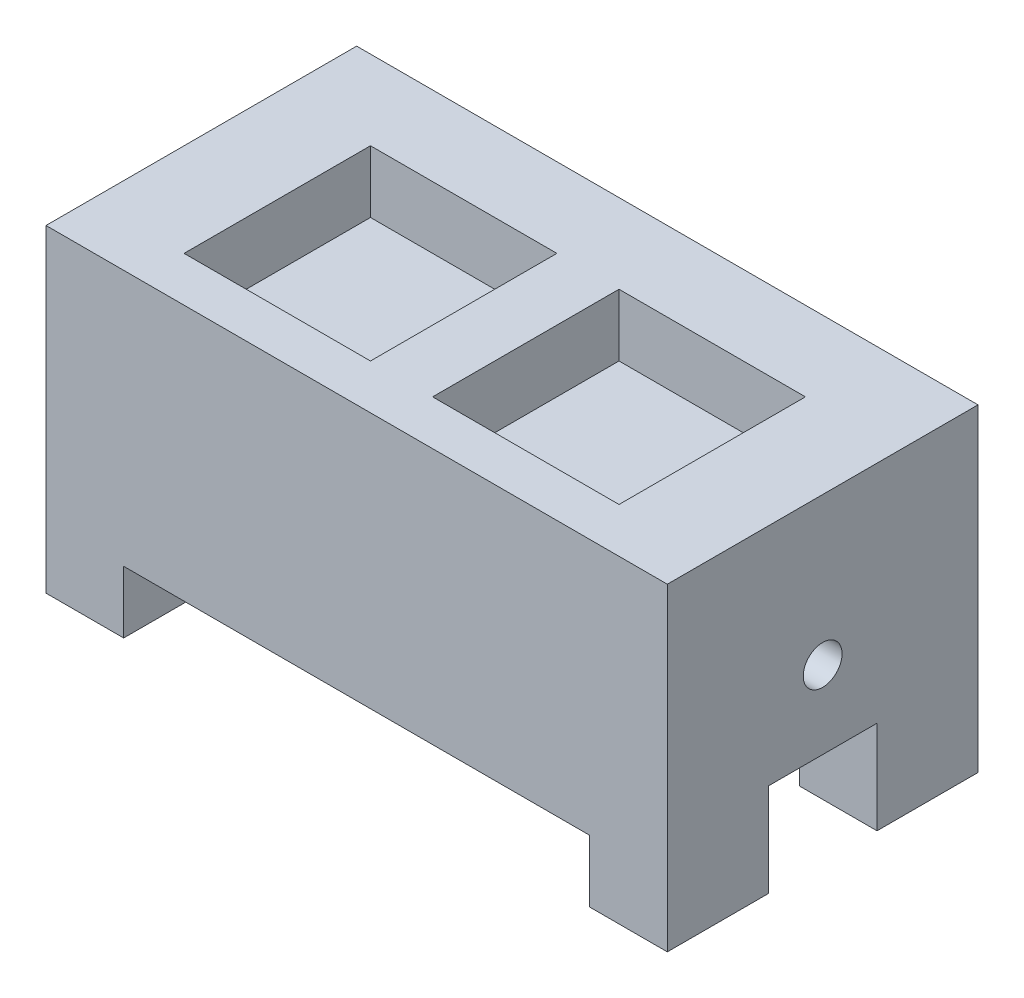
ISO-10303-21;
HEADER;
FILE_DESCRIPTION(('STEP AP214'),'2;1');
FILE_NAME('part.step','',(''),(''),'','','');
FILE_SCHEMA(('AUTOMOTIVE_DESIGN { 1 0 10303 214 1 1 1 1 }'));
ENDSEC;
DATA;
#1=APPLICATION_CONTEXT('core data for automotive mechanical design processes');
#2=APPLICATION_PROTOCOL_DEFINITION('international standard','automotive_design',2000,#1);
#3=PRODUCT_CONTEXT('',#1,'mechanical');
#4=PRODUCT('Part','Part','',(#3));
#5=PRODUCT_RELATED_PRODUCT_CATEGORY('part','',(#4));
#6=PRODUCT_DEFINITION_FORMATION('','',#4);
#7=PRODUCT_DEFINITION_CONTEXT('part definition',#1,'design');
#8=PRODUCT_DEFINITION('design','',#6,#7);
#9=PRODUCT_DEFINITION_SHAPE('','',#8);
#10=(LENGTH_UNIT() NAMED_UNIT(*) SI_UNIT(.MILLI.,.METRE.));
#11=(NAMED_UNIT(*) PLANE_ANGLE_UNIT() SI_UNIT($,.RADIAN.));
#12=(NAMED_UNIT(*) SI_UNIT($,.STERADIAN.) SOLID_ANGLE_UNIT());
#13=UNCERTAINTY_MEASURE_WITH_UNIT(LENGTH_MEASURE(1.E-05),#10,'distance_accuracy_value','');
#14=(GEOMETRIC_REPRESENTATION_CONTEXT(3) GLOBAL_UNCERTAINTY_ASSIGNED_CONTEXT((#13)) GLOBAL_UNIT_ASSIGNED_CONTEXT((#10,
#11,#12)) REPRESENTATION_CONTEXT('',''));
#15=CARTESIAN_POINT('',(0.,0.,0.));
#16=DIRECTION('',(0.,0.,1.));
#17=DIRECTION('',(1.,0.,0.));
#18=AXIS2_PLACEMENT_3D('',#15,#16,#17);
#19=CARTESIAN_POINT('',(0.,0.,40.));
#20=DIRECTION('',(0.,1.,0.));
#21=DIRECTION('',(0.,0.,1.));
#22=AXIS2_PLACEMENT_3D('',#19,#20,#21);
#23=PLANE('',#22);
#24=DIRECTION('',(-1.,0.,0.));
#25=VECTOR('',#24,1.);
#26=CARTESIAN_POINT('',(80.,0.,13.));
#27=LINE('',#26,#25);
#28=CARTESIAN_POINT('',(10.,0.,13.));
#29=VERTEX_POINT('',#28);
#30=CARTESIAN_POINT('',(0.,0.,13.));
#31=VERTEX_POINT('',#30);
#32=EDGE_CURVE('E310',#29,#31,#27,.T.);
#33=ORIENTED_EDGE('',*,*,#32,.T.);
#34=DIRECTION('',(0.,0.,-1.));
#35=VECTOR('',#34,1.);
#36=CARTESIAN_POINT('',(0.,0.,40.));
#37=LINE('',#36,#35);
#38=CARTESIAN_POINT('',(0.,0.,0.));
#39=VERTEX_POINT('',#38);
#40=EDGE_CURVE('E443',#31,#39,#37,.T.);
#41=ORIENTED_EDGE('',*,*,#40,.T.);
#42=DIRECTION('',(1.,0.,0.));
#43=VECTOR('',#42,1.);
#44=CARTESIAN_POINT('',(0.,0.,0.));
#45=LINE('',#44,#43);
#46=CARTESIAN_POINT('',(10.,0.,0.));
#47=VERTEX_POINT('',#46);
#48=EDGE_CURVE('E394',#39,#47,#45,.T.);
#49=ORIENTED_EDGE('',*,*,#48,.T.);
#50=DIRECTION('',(0.,0.,-1.));
#51=VECTOR('',#50,1.);
#52=CARTESIAN_POINT('',(10.,0.,40.));
#53=LINE('',#52,#51);
#54=EDGE_CURVE('E439',#29,#47,#53,.T.);
#55=ORIENTED_EDGE('',*,*,#54,.F.);
#56=EDGE_LOOP('',(#33,#41,#49,#55));
#57=FACE_BOUND('',#56,.T.);
#58=ADVANCED_FACE('F39',(#57),#23,.F.);
#59=CARTESIAN_POINT('',(10.,0.,40.));
#60=DIRECTION('',(-1.,0.,0.));
#61=DIRECTION('',(0.,0.,1.));
#62=AXIS2_PLACEMENT_3D('',#59,#60,#61);
#63=PLANE('',#62);
#64=DIRECTION('',(0.,1.,0.));
#65=VECTOR('',#64,1.);
#66=CARTESIAN_POINT('',(10.,0.,13.));
#67=LINE('',#66,#65);
#68=CARTESIAN_POINT('',(10.,8.,13.));
#69=VERTEX_POINT('',#68);
#70=EDGE_CURVE('E344',#29,#69,#67,.T.);
#71=ORIENTED_EDGE('',*,*,#70,.F.);
#72=ORIENTED_EDGE('',*,*,#54,.T.);
#73=DIRECTION('',(0.,1.,0.));
#74=VECTOR('',#73,1.);
#75=CARTESIAN_POINT('',(10.,0.,0.));
#76=LINE('',#75,#74);
#77=CARTESIAN_POINT('',(10.,8.,0.));
#78=VERTEX_POINT('',#77);
#79=EDGE_CURVE('E398',#47,#78,#76,.T.);
#80=ORIENTED_EDGE('',*,*,#79,.T.);
#81=DIRECTION('',(0.,0.,-1.));
#82=VECTOR('',#81,1.);
#83=CARTESIAN_POINT('',(10.,8.,40.));
#84=LINE('',#83,#82);
#85=EDGE_CURVE('E434',#69,#78,#84,.T.);
#86=ORIENTED_EDGE('',*,*,#85,.F.);
#87=EDGE_LOOP('',(#71,#72,#80,#86));
#88=FACE_BOUND('',#87,.T.);
#89=ADVANCED_FACE('F468',(#88),#63,.F.);
#90=CARTESIAN_POINT('',(10.,8.,40.));
#91=DIRECTION('',(0.,1.,0.));
#92=DIRECTION('',(0.,0.,1.));
#93=AXIS2_PLACEMENT_3D('',#90,#91,#92);
#94=PLANE('',#93);
#95=DIRECTION('',(1.,0.,0.));
#96=VECTOR('',#95,1.);
#97=CARTESIAN_POINT('',(10.,8.,13.));
#98=LINE('',#97,#96);
#99=CARTESIAN_POINT('',(70.,8.,13.));
#100=VERTEX_POINT('',#99);
#101=EDGE_CURVE('E341',#69,#100,#98,.T.);
#102=ORIENTED_EDGE('',*,*,#101,.F.);
#103=ORIENTED_EDGE('',*,*,#85,.T.);
#104=DIRECTION('',(1.,0.,0.));
#105=VECTOR('',#104,1.);
#106=CARTESIAN_POINT('',(10.,8.,0.));
#107=LINE('',#106,#105);
#108=CARTESIAN_POINT('',(70.,8.,0.));
#109=VERTEX_POINT('',#108);
#110=EDGE_CURVE('E402',#78,#109,#107,.T.);
#111=ORIENTED_EDGE('',*,*,#110,.T.);
#112=DIRECTION('',(0.,0.,-1.));
#113=VECTOR('',#112,1.);
#114=CARTESIAN_POINT('',(70.,8.,40.));
#115=LINE('',#114,#113);
#116=EDGE_CURVE('E429',#100,#109,#115,.T.);
#117=ORIENTED_EDGE('',*,*,#116,.F.);
#118=EDGE_LOOP('',(#102,#103,#111,#117));
#119=FACE_BOUND('',#118,.T.);
#120=ADVANCED_FACE('F525',(#119),#94,.F.);
#121=CARTESIAN_POINT('',(70.,8.,40.));
#122=DIRECTION('',(1.,0.,0.));
#123=DIRECTION('',(0.,0.,-1.));
#124=AXIS2_PLACEMENT_3D('',#121,#122,#123);
#125=PLANE('',#124);
#126=DIRECTION('',(0.,-1.,0.));
#127=VECTOR('',#126,1.);
#128=CARTESIAN_POINT('',(70.,8.,13.));
#129=LINE('',#128,#127);
#130=CARTESIAN_POINT('',(70.,0.,13.));
#131=VERTEX_POINT('',#130);
#132=EDGE_CURVE('E298',#100,#131,#129,.T.);
#133=ORIENTED_EDGE('',*,*,#132,.F.);
#134=ORIENTED_EDGE('',*,*,#116,.T.);
#135=DIRECTION('',(0.,-1.,0.));
#136=VECTOR('',#135,1.);
#137=CARTESIAN_POINT('',(70.,8.,0.));
#138=LINE('',#137,#136);
#139=CARTESIAN_POINT('',(70.,0.,0.));
#140=VERTEX_POINT('',#139);
#141=EDGE_CURVE('E406',#109,#140,#138,.T.);
#142=ORIENTED_EDGE('',*,*,#141,.T.);
#143=DIRECTION('',(0.,0.,-1.));
#144=VECTOR('',#143,1.);
#145=CARTESIAN_POINT('',(70.,0.,40.));
#146=LINE('',#145,#144);
#147=EDGE_CURVE('E424',#131,#140,#146,.T.);
#148=ORIENTED_EDGE('',*,*,#147,.F.);
#149=EDGE_LOOP('',(#133,#134,#142,#148));
#150=FACE_BOUND('',#149,.T.);
#151=ADVANCED_FACE('F521',(#150),#125,.F.);
#152=CARTESIAN_POINT('',(70.,0.,40.));
#153=DIRECTION('',(0.,1.,0.));
#154=DIRECTION('',(0.,0.,1.));
#155=AXIS2_PLACEMENT_3D('',#152,#153,#154);
#156=PLANE('',#155);
#157=CARTESIAN_POINT('',(80.,0.,13.));
#158=VERTEX_POINT('',#157);
#159=EDGE_CURVE('E311',#158,#131,#27,.T.);
#160=ORIENTED_EDGE('',*,*,#159,.T.);
#161=ORIENTED_EDGE('',*,*,#147,.T.);
#162=DIRECTION('',(1.,0.,0.));
#163=VECTOR('',#162,1.);
#164=CARTESIAN_POINT('',(70.,0.,0.));
#165=LINE('',#164,#163);
#166=CARTESIAN_POINT('',(80.,0.,0.));
#167=VERTEX_POINT('',#166);
#168=EDGE_CURVE('E410',#140,#167,#165,.T.);
#169=ORIENTED_EDGE('',*,*,#168,.T.);
#170=DIRECTION('',(0.,0.,-1.));
#171=VECTOR('',#170,1.);
#172=CARTESIAN_POINT('',(80.,0.,40.));
#173=LINE('',#172,#171);
#174=EDGE_CURVE('E419',#158,#167,#173,.T.);
#175=ORIENTED_EDGE('',*,*,#174,.F.);
#176=EDGE_LOOP('',(#160,#161,#169,#175));
#177=FACE_BOUND('',#176,.T.);
#178=ADVANCED_FACE('F517',(#177),#156,.F.);
#179=CARTESIAN_POINT('',(80.,41.,40.));
#180=DIRECTION('',(0.,-1.,0.));
#181=DIRECTION('',(1.,0.,0.));
#182=AXIS2_PLACEMENT_3D('',#179,#180,#181);
#183=PLANE('',#182);
#184=DIRECTION('',(1.,0.,0.));
#185=VECTOR('',#184,1.);
#186=CARTESIAN_POINT('',(12.,41.,34.2209125407346));
#187=LINE('',#186,#185);
#188=CARTESIAN_POINT('',(12.,41.,34.2209125407346));
#189=VERTEX_POINT('',#188);
#190=CARTESIAN_POINT('',(36.,41.,34.2209125407346));
#191=VERTEX_POINT('',#190);
#192=EDGE_CURVE('E237',#189,#191,#187,.T.);
#193=ORIENTED_EDGE('',*,*,#192,.F.);
#194=DIRECTION('',(0.,0.,1.));
#195=VECTOR('',#194,1.);
#196=CARTESIAN_POINT('',(12.,41.,10.2209125407346));
#197=LINE('',#196,#195);
#198=CARTESIAN_POINT('',(12.,41.,10.2209125407346));
#199=VERTEX_POINT('',#198);
#200=EDGE_CURVE('E55',#199,#189,#197,.T.);
#201=ORIENTED_EDGE('',*,*,#200,.F.);
#202=DIRECTION('',(-1.,0.,0.));
#203=VECTOR('',#202,1.);
#204=CARTESIAN_POINT('',(12.,41.,10.2209125407346));
#205=LINE('',#204,#203);
#206=CARTESIAN_POINT('',(36.,41.,10.2209125407346));
#207=VERTEX_POINT('',#206);
#208=EDGE_CURVE('E224',#207,#199,#205,.T.);
#209=ORIENTED_EDGE('',*,*,#208,.F.);
#210=DIRECTION('',(0.,0.,-1.));
#211=VECTOR('',#210,1.);
#212=CARTESIAN_POINT('',(36.,41.,10.2209125407346));
#213=LINE('',#212,#211);
#214=EDGE_CURVE('E228',#191,#207,#213,.T.);
#215=ORIENTED_EDGE('',*,*,#214,.F.);
#216=EDGE_LOOP('',(#193,#201,#209,#215));
#217=FACE_BOUND('',#216,.T.);
#218=DIRECTION('',(1.,0.,0.));
#219=VECTOR('',#218,1.);
#220=CARTESIAN_POINT('',(44.,41.,34.2209125407346));
#221=LINE('',#220,#219);
#222=CARTESIAN_POINT('',(44.,41.,34.2209125407346));
#223=VERTEX_POINT('',#222);
#224=CARTESIAN_POINT('',(68.,41.,34.2209125407346));
#225=VERTEX_POINT('',#224);
#226=EDGE_CURVE('E273',#223,#225,#221,.T.);
#227=ORIENTED_EDGE('',*,*,#226,.F.);
#228=DIRECTION('',(0.,0.,1.));
#229=VECTOR('',#228,1.);
#230=CARTESIAN_POINT('',(44.,41.,10.2209125407346));
#231=LINE('',#230,#229);
#232=CARTESIAN_POINT('',(44.,41.,10.2209125407346));
#233=VERTEX_POINT('',#232);
#234=EDGE_CURVE('E63',#233,#223,#231,.T.);
#235=ORIENTED_EDGE('',*,*,#234,.F.);
#236=DIRECTION('',(-1.,0.,0.));
#237=VECTOR('',#236,1.);
#238=CARTESIAN_POINT('',(44.,41.,10.2209125407346));
#239=LINE('',#238,#237);
#240=CARTESIAN_POINT('',(68.,41.,10.2209125407346));
#241=VERTEX_POINT('',#240);
#242=EDGE_CURVE('E258',#241,#233,#239,.T.);
#243=ORIENTED_EDGE('',*,*,#242,.F.);
#244=DIRECTION('',(0.,0.,-1.));
#245=VECTOR('',#244,1.);
#246=CARTESIAN_POINT('',(68.,41.,10.2209125407346));
#247=LINE('',#246,#245);
#248=EDGE_CURVE('E277',#225,#241,#247,.T.);
#249=ORIENTED_EDGE('',*,*,#248,.F.);
#250=EDGE_LOOP('',(#227,#235,#243,#249));
#251=FACE_BOUND('',#250,.T.);
#252=DIRECTION('',(-1.,0.,0.));
#253=VECTOR('',#252,1.);
#254=CARTESIAN_POINT('',(80.,41.,0.));
#255=LINE('',#254,#253);
#256=CARTESIAN_POINT('',(80.,41.,0.));
#257=VERTEX_POINT('',#256);
#258=CARTESIAN_POINT('',(0.,41.,0.));
#259=VERTEX_POINT('',#258);
#260=EDGE_CURVE('E359',#257,#259,#255,.T.);
#261=ORIENTED_EDGE('',*,*,#260,.T.);
#262=DIRECTION('',(0.,0.,-1.));
#263=VECTOR('',#262,1.);
#264=CARTESIAN_POINT('',(0.,41.,40.));
#265=LINE('',#264,#263);
#266=CARTESIAN_POINT('',(0.,41.,40.));
#267=VERTEX_POINT('',#266);
#268=EDGE_CURVE('E11',#267,#259,#265,.T.);
#269=ORIENTED_EDGE('',*,*,#268,.F.);
#270=DIRECTION('',(-1.,0.,0.));
#271=VECTOR('',#270,1.);
#272=CARTESIAN_POINT('',(80.,41.,40.));
#273=LINE('',#272,#271);
#274=CARTESIAN_POINT('',(80.,41.,40.));
#275=VERTEX_POINT('',#274);
#276=EDGE_CURVE('E360',#275,#267,#273,.T.);
#277=ORIENTED_EDGE('',*,*,#276,.F.);
#278=DIRECTION('',(0.,0.,-1.));
#279=VECTOR('',#278,1.);
#280=CARTESIAN_POINT('',(80.,41.,40.));
#281=LINE('',#280,#279);
#282=EDGE_CURVE('E386',#275,#257,#281,.T.);
#283=ORIENTED_EDGE('',*,*,#282,.T.);
#284=EDGE_LOOP('',(#261,#269,#277,#283));
#285=FACE_BOUND('',#284,.T.);
#286=ADVANCED_FACE('F41',(#217,#251,#285),#183,.F.);
#287=CARTESIAN_POINT('',(0.,41.,40.));
#288=DIRECTION('',(1.,0.,0.));
#289=DIRECTION('',(0.,0.,-1.));
#290=AXIS2_PLACEMENT_3D('',#287,#288,#289);
#291=PLANE('',#290);
#292=CARTESIAN_POINT('',(0.,22.,20.));
#293=DIRECTION('',(-1.,0.,0.));
#294=DIRECTION('',(0.,0.,1.));
#295=AXIS2_PLACEMENT_3D('',#292,#293,#294);
#296=CIRCLE('',#295,2.5);
#297=CARTESIAN_POINT('',(0.,22.,22.5));
#298=VERTEX_POINT('',#297);
#299=EDGE_CURVE('E299',#298,#298,#296,.T.);
#300=ORIENTED_EDGE('',*,*,#299,.F.);
#301=EDGE_LOOP('',(#300));
#302=FACE_BOUND('',#301,.T.);
#303=DIRECTION('',(0.,0.,1.));
#304=VECTOR('',#303,1.);
#305=CARTESIAN_POINT('',(0.,12.,13.));
#306=LINE('',#305,#304);
#307=CARTESIAN_POINT('',(0.,12.,13.));
#308=VERTEX_POINT('',#307);
#309=CARTESIAN_POINT('',(0.,12.,27.));
#310=VERTEX_POINT('',#309);
#311=EDGE_CURVE('E303',#308,#310,#306,.T.);
#312=ORIENTED_EDGE('',*,*,#311,.T.);
#313=DIRECTION('',(0.,1.,0.));
#314=VECTOR('',#313,1.);
#315=CARTESIAN_POINT('',(0.,0.,27.));
#316=LINE('',#315,#314);
#317=CARTESIAN_POINT('',(0.,0.,27.));
#318=VERTEX_POINT('',#317);
#319=EDGE_CURVE('E323',#318,#310,#316,.T.);
#320=ORIENTED_EDGE('',*,*,#319,.F.);
#321=CARTESIAN_POINT('',(0.,0.,40.));
#322=VERTEX_POINT('',#321);
#323=EDGE_CURVE('E48',#322,#318,#37,.T.);
#324=ORIENTED_EDGE('',*,*,#323,.F.);
#325=DIRECTION('',(0.,-1.,0.));
#326=VECTOR('',#325,1.);
#327=CARTESIAN_POINT('',(0.,41.,40.));
#328=LINE('',#327,#326);
#329=EDGE_CURVE('E364',#267,#322,#328,.T.);
#330=ORIENTED_EDGE('',*,*,#329,.F.);
#331=ORIENTED_EDGE('',*,*,#268,.T.);
#332=DIRECTION('',(0.,-1.,0.));
#333=VECTOR('',#332,1.);
#334=CARTESIAN_POINT('',(0.,41.,0.));
#335=LINE('',#334,#333);
#336=EDGE_CURVE('E390',#259,#39,#335,.T.);
#337=ORIENTED_EDGE('',*,*,#336,.T.);
#338=ORIENTED_EDGE('',*,*,#40,.F.);
#339=DIRECTION('',(0.,1.,0.));
#340=VECTOR('',#339,1.);
#341=CARTESIAN_POINT('',(0.,0.,13.));
#342=LINE('',#341,#340);
#343=EDGE_CURVE('E319',#31,#308,#342,.T.);
#344=ORIENTED_EDGE('',*,*,#343,.T.);
#345=EDGE_LOOP('',(#312,#320,#324,#330,#331,#337,#338,#344));
#346=FACE_BOUND('',#345,.T.);
#347=ADVANCED_FACE('F458',(#302,#346),#291,.F.);
#348=ORIENTED_EDGE('',*,*,#323,.T.);
#349=DIRECTION('',(-1.,0.,0.));
#350=VECTOR('',#349,1.);
#351=CARTESIAN_POINT('',(80.,0.,27.));
#352=LINE('',#351,#350);
#353=CARTESIAN_POINT('',(10.,0.,27.));
#354=VERTEX_POINT('',#353);
#355=EDGE_CURVE('E306',#354,#318,#352,.T.);
#356=ORIENTED_EDGE('',*,*,#355,.F.);
#357=CARTESIAN_POINT('',(10.,0.,40.));
#358=VERTEX_POINT('',#357);
#359=EDGE_CURVE('E440',#358,#354,#53,.T.);
#360=ORIENTED_EDGE('',*,*,#359,.F.);
#361=DIRECTION('',(1.,0.,0.));
#362=VECTOR('',#361,1.);
#363=CARTESIAN_POINT('',(0.,0.,40.));
#364=LINE('',#363,#362);
#365=EDGE_CURVE('E368',#322,#358,#364,.T.);
#366=ORIENTED_EDGE('',*,*,#365,.F.);
#367=EDGE_LOOP('',(#348,#356,#360,#366));
#368=FACE_BOUND('',#367,.T.);
#369=ADVANCED_FACE('F508',(#368),#23,.F.);
#370=ORIENTED_EDGE('',*,*,#359,.T.);
#371=DIRECTION('',(0.,1.,0.));
#372=VECTOR('',#371,1.);
#373=CARTESIAN_POINT('',(10.,0.,27.));
#374=LINE('',#373,#372);
#375=CARTESIAN_POINT('',(10.,8.,27.));
#376=VERTEX_POINT('',#375);
#377=EDGE_CURVE('E355',#354,#376,#374,.T.);
#378=ORIENTED_EDGE('',*,*,#377,.T.);
#379=CARTESIAN_POINT('',(10.,8.,40.));
#380=VERTEX_POINT('',#379);
#381=EDGE_CURVE('E435',#380,#376,#84,.T.);
#382=ORIENTED_EDGE('',*,*,#381,.F.);
#383=DIRECTION('',(0.,1.,0.));
#384=VECTOR('',#383,1.);
#385=CARTESIAN_POINT('',(10.,0.,40.));
#386=LINE('',#385,#384);
#387=EDGE_CURVE('E371',#358,#380,#386,.T.);
#388=ORIENTED_EDGE('',*,*,#387,.F.);
#389=EDGE_LOOP('',(#370,#378,#382,#388));
#390=FACE_BOUND('',#389,.T.);
#391=ADVANCED_FACE('F506',(#390),#63,.F.);
#392=ORIENTED_EDGE('',*,*,#381,.T.);
#393=DIRECTION('',(1.,0.,0.));
#394=VECTOR('',#393,1.);
#395=CARTESIAN_POINT('',(10.,8.,27.));
#396=LINE('',#395,#394);
#397=CARTESIAN_POINT('',(70.,8.,27.));
#398=VERTEX_POINT('',#397);
#399=EDGE_CURVE('E351',#376,#398,#396,.T.);
#400=ORIENTED_EDGE('',*,*,#399,.T.);
#401=CARTESIAN_POINT('',(70.,8.,40.));
#402=VERTEX_POINT('',#401);
#403=EDGE_CURVE('E430',#402,#398,#115,.T.);
#404=ORIENTED_EDGE('',*,*,#403,.F.);
#405=DIRECTION('',(1.,0.,0.));
#406=VECTOR('',#405,1.);
#407=CARTESIAN_POINT('',(10.,8.,40.));
#408=LINE('',#407,#406);
#409=EDGE_CURVE('E374',#380,#402,#408,.T.);
#410=ORIENTED_EDGE('',*,*,#409,.F.);
#411=EDGE_LOOP('',(#392,#400,#404,#410));
#412=FACE_BOUND('',#411,.T.);
#413=ADVANCED_FACE('F503',(#412),#94,.F.);
#414=ORIENTED_EDGE('',*,*,#403,.T.);
#415=DIRECTION('',(0.,-1.,0.));
#416=VECTOR('',#415,1.);
#417=CARTESIAN_POINT('',(70.,7.99999999999999,27.));
#418=LINE('',#417,#416);
#419=CARTESIAN_POINT('',(70.,0.,27.));
#420=VERTEX_POINT('',#419);
#421=EDGE_CURVE('E347',#398,#420,#418,.T.);
#422=ORIENTED_EDGE('',*,*,#421,.T.);
#423=CARTESIAN_POINT('',(70.,0.,40.));
#424=VERTEX_POINT('',#423);
#425=EDGE_CURVE('E425',#424,#420,#146,.T.);
#426=ORIENTED_EDGE('',*,*,#425,.F.);
#427=DIRECTION('',(0.,-1.,0.));
#428=VECTOR('',#427,1.);
#429=CARTESIAN_POINT('',(70.,8.,40.));
#430=LINE('',#429,#428);
#431=EDGE_CURVE('E377',#402,#424,#430,.T.);
#432=ORIENTED_EDGE('',*,*,#431,.F.);
#433=EDGE_LOOP('',(#414,#422,#426,#432));
#434=FACE_BOUND('',#433,.T.);
#435=ADVANCED_FACE('F498',(#434),#125,.F.);
#436=ORIENTED_EDGE('',*,*,#425,.T.);
#437=CARTESIAN_POINT('',(80.,0.,27.));
#438=VERTEX_POINT('',#437);
#439=EDGE_CURVE('E307',#438,#420,#352,.T.);
#440=ORIENTED_EDGE('',*,*,#439,.F.);
#441=CARTESIAN_POINT('',(80.,0.,40.));
#442=VERTEX_POINT('',#441);
#443=EDGE_CURVE('E420',#442,#438,#173,.T.);
#444=ORIENTED_EDGE('',*,*,#443,.F.);
#445=DIRECTION('',(1.,0.,0.));
#446=VECTOR('',#445,1.);
#447=CARTESIAN_POINT('',(70.,0.,40.));
#448=LINE('',#447,#446);
#449=EDGE_CURVE('E380',#424,#442,#448,.T.);
#450=ORIENTED_EDGE('',*,*,#449,.F.);
#451=EDGE_LOOP('',(#436,#440,#444,#450));
#452=FACE_BOUND('',#451,.T.);
#453=ADVANCED_FACE('F495',(#452),#156,.F.);
#454=CARTESIAN_POINT('',(80.,0.,40.));
#455=DIRECTION('',(-1.,0.,0.));
#456=DIRECTION('',(0.,0.,1.));
#457=AXIS2_PLACEMENT_3D('',#454,#455,#456);
#458=PLANE('',#457);
#459=CARTESIAN_POINT('',(80.,22.,20.));
#460=DIRECTION('',(-1.,0.,0.));
#461=DIRECTION('',(0.,0.,1.));
#462=AXIS2_PLACEMENT_3D('',#459,#460,#461);
#463=CIRCLE('',#462,2.5);
#464=CARTESIAN_POINT('',(80.,22.,22.5));
#465=VERTEX_POINT('',#464);
#466=EDGE_CURVE('E294',#465,#465,#463,.T.);
#467=ORIENTED_EDGE('',*,*,#466,.T.);
#468=EDGE_LOOP('',(#467));
#469=FACE_BOUND('',#468,.T.);
#470=ORIENTED_EDGE('',*,*,#443,.T.);
#471=DIRECTION('',(0.,1.,0.));
#472=VECTOR('',#471,1.);
#473=CARTESIAN_POINT('',(80.,0.,27.));
#474=LINE('',#473,#472);
#475=CARTESIAN_POINT('',(80.,12.,27.));
#476=VERTEX_POINT('',#475);
#477=EDGE_CURVE('E333',#438,#476,#474,.T.);
#478=ORIENTED_EDGE('',*,*,#477,.T.);
#479=DIRECTION('',(0.,0.,1.));
#480=VECTOR('',#479,1.);
#481=CARTESIAN_POINT('',(80.,12.,13.));
#482=LINE('',#481,#480);
#483=CARTESIAN_POINT('',(80.,12.,13.));
#484=VERTEX_POINT('',#483);
#485=EDGE_CURVE('E324',#484,#476,#482,.T.);
#486=ORIENTED_EDGE('',*,*,#485,.F.);
#487=DIRECTION('',(0.,1.,0.));
#488=VECTOR('',#487,1.);
#489=CARTESIAN_POINT('',(80.,0.,13.));
#490=LINE('',#489,#488);
#491=EDGE_CURVE('E318',#158,#484,#490,.T.);
#492=ORIENTED_EDGE('',*,*,#491,.F.);
#493=ORIENTED_EDGE('',*,*,#174,.T.);
#494=DIRECTION('',(0.,1.,0.));
#495=VECTOR('',#494,1.);
#496=CARTESIAN_POINT('',(80.,0.,0.));
#497=LINE('',#496,#495);
#498=EDGE_CURVE('E365',#167,#257,#497,.T.);
#499=ORIENTED_EDGE('',*,*,#498,.T.);
#500=ORIENTED_EDGE('',*,*,#282,.F.);
#501=DIRECTION('',(0.,1.,0.));
#502=VECTOR('',#501,1.);
#503=CARTESIAN_POINT('',(80.,0.,40.));
#504=LINE('',#503,#502);
#505=EDGE_CURVE('E383',#442,#275,#504,.T.);
#506=ORIENTED_EDGE('',*,*,#505,.F.);
#507=EDGE_LOOP('',(#470,#478,#486,#492,#493,#499,#500,#506));
#508=FACE_BOUND('',#507,.T.);
#509=ADVANCED_FACE('F488',(#469,#508),#458,.F.);
#510=CARTESIAN_POINT('',(0.,0.,40.));
#511=DIRECTION('',(0.,0.,1.));
#512=DIRECTION('',(1.,0.,0.));
#513=AXIS2_PLACEMENT_3D('',#510,#511,#512);
#514=PLANE('',#513);
#515=ORIENTED_EDGE('',*,*,#276,.T.);
#516=ORIENTED_EDGE('',*,*,#329,.T.);
#517=ORIENTED_EDGE('',*,*,#365,.T.);
#518=ORIENTED_EDGE('',*,*,#387,.T.);
#519=ORIENTED_EDGE('',*,*,#409,.T.);
#520=ORIENTED_EDGE('',*,*,#431,.T.);
#521=ORIENTED_EDGE('',*,*,#449,.T.);
#522=ORIENTED_EDGE('',*,*,#505,.T.);
#523=EDGE_LOOP('',(#515,#516,#517,#518,#519,#520,#521,#522));
#524=FACE_BOUND('',#523,.T.);
#525=ADVANCED_FACE('F510',(#524),#514,.T.);
#526=CARTESIAN_POINT('',(0.,0.,0.));
#527=DIRECTION('',(0.,0.,1.));
#528=DIRECTION('',(1.,0.,0.));
#529=AXIS2_PLACEMENT_3D('',#526,#527,#528);
#530=PLANE('',#529);
#531=ORIENTED_EDGE('',*,*,#260,.F.);
#532=ORIENTED_EDGE('',*,*,#498,.F.);
#533=ORIENTED_EDGE('',*,*,#168,.F.);
#534=ORIENTED_EDGE('',*,*,#141,.F.);
#535=ORIENTED_EDGE('',*,*,#110,.F.);
#536=ORIENTED_EDGE('',*,*,#79,.F.);
#537=ORIENTED_EDGE('',*,*,#48,.F.);
#538=ORIENTED_EDGE('',*,*,#336,.F.);
#539=EDGE_LOOP('',(#531,#532,#533,#534,#535,#536,#537,#538));
#540=FACE_BOUND('',#539,.T.);
#541=ADVANCED_FACE('F462',(#540),#530,.F.);
#542=CARTESIAN_POINT('',(80.,0.,27.));
#543=DIRECTION('',(0.,0.,1.));
#544=DIRECTION('',(0.,-1.,0.));
#545=AXIS2_PLACEMENT_3D('',#542,#543,#544);
#546=PLANE('',#545);
#547=ORIENTED_EDGE('',*,*,#355,.T.);
#548=ORIENTED_EDGE('',*,*,#319,.T.);
#549=DIRECTION('',(-1.,0.,0.));
#550=VECTOR('',#549,1.);
#551=CARTESIAN_POINT('',(80.,12.,27.));
#552=LINE('',#551,#550);
#553=EDGE_CURVE('E247',#476,#310,#552,.T.);
#554=ORIENTED_EDGE('',*,*,#553,.F.);
#555=ORIENTED_EDGE('',*,*,#477,.F.);
#556=ORIENTED_EDGE('',*,*,#439,.T.);
#557=ORIENTED_EDGE('',*,*,#421,.F.);
#558=ORIENTED_EDGE('',*,*,#399,.F.);
#559=ORIENTED_EDGE('',*,*,#377,.F.);
#560=EDGE_LOOP('',(#547,#548,#554,#555,#556,#557,#558,#559));
#561=FACE_BOUND('',#560,.T.);
#562=ADVANCED_FACE('F478',(#561),#546,.F.);
#563=CARTESIAN_POINT('',(80.,0.,13.));
#564=DIRECTION('',(0.,0.,1.));
#565=DIRECTION('',(1.,0.,0.));
#566=AXIS2_PLACEMENT_3D('',#563,#564,#565);
#567=PLANE('',#566);
#568=ORIENTED_EDGE('',*,*,#70,.T.);
#569=ORIENTED_EDGE('',*,*,#101,.T.);
#570=ORIENTED_EDGE('',*,*,#132,.T.);
#571=ORIENTED_EDGE('',*,*,#159,.F.);
#572=ORIENTED_EDGE('',*,*,#491,.T.);
#573=DIRECTION('',(-1.,0.,0.));
#574=VECTOR('',#573,1.);
#575=CARTESIAN_POINT('',(80.,12.,13.));
#576=LINE('',#575,#574);
#577=EDGE_CURVE('E315',#484,#308,#576,.T.);
#578=ORIENTED_EDGE('',*,*,#577,.T.);
#579=ORIENTED_EDGE('',*,*,#343,.F.);
#580=ORIENTED_EDGE('',*,*,#32,.F.);
#581=EDGE_LOOP('',(#568,#569,#570,#571,#572,#578,#579,#580));
#582=FACE_BOUND('',#581,.T.);
#583=ADVANCED_FACE('F527',(#582),#567,.T.);
#584=CARTESIAN_POINT('',(80.,12.,13.));
#585=DIRECTION('',(0.,-1.,0.));
#586=DIRECTION('',(0.,0.,-1.));
#587=AXIS2_PLACEMENT_3D('',#584,#585,#586);
#588=PLANE('',#587);
#589=ORIENTED_EDGE('',*,*,#311,.F.);
#590=ORIENTED_EDGE('',*,*,#577,.F.);
#591=ORIENTED_EDGE('',*,*,#485,.T.);
#592=ORIENTED_EDGE('',*,*,#553,.T.);
#593=EDGE_LOOP('',(#589,#590,#591,#592));
#594=FACE_BOUND('',#593,.T.);
#595=ADVANCED_FACE('F484',(#594),#588,.T.);
#596=CARTESIAN_POINT('',(80.,22.,20.));
#597=DIRECTION('',(-1.,0.,0.));
#598=DIRECTION('',(0.,0.,1.));
#599=AXIS2_PLACEMENT_3D('',#596,#597,#598);
#600=CYLINDRICAL_SURFACE('',#599,2.5);
#601=ORIENTED_EDGE('',*,*,#466,.F.);
#602=EDGE_LOOP('',(#601));
#603=FACE_BOUND('',#602,.T.);
#604=ORIENTED_EDGE('',*,*,#299,.T.);
#605=EDGE_LOOP('',(#604));
#606=FACE_BOUND('',#605,.T.);
#607=ADVANCED_FACE('F534',(#603,#606),#600,.F.);
#608=CARTESIAN_POINT('',(44.,33.,10.2209125407346));
#609=DIRECTION('',(-1.,0.,0.));
#610=DIRECTION('',(0.,-1.,0.));
#611=AXIS2_PLACEMENT_3D('',#608,#609,#610);
#612=PLANE('',#611);
#613=ORIENTED_EDGE('',*,*,#234,.T.);
#614=DIRECTION('',(0.,1.,0.));
#615=VECTOR('',#614,1.);
#616=CARTESIAN_POINT('',(44.,33.,34.2209125407346));
#617=LINE('',#616,#615);
#618=CARTESIAN_POINT('',(44.,33.,34.2209125407346));
#619=VERTEX_POINT('',#618);
#620=EDGE_CURVE('E270',#619,#223,#617,.T.);
#621=ORIENTED_EDGE('',*,*,#620,.F.);
#622=DIRECTION('',(0.,0.,1.));
#623=VECTOR('',#622,1.);
#624=CARTESIAN_POINT('',(44.,33.,10.2209125407346));
#625=LINE('',#624,#623);
#626=CARTESIAN_POINT('',(44.,33.,10.2209125407346));
#627=VERTEX_POINT('',#626);
#628=EDGE_CURVE('E253',#627,#619,#625,.T.);
#629=ORIENTED_EDGE('',*,*,#628,.F.);
#630=DIRECTION('',(0.,1.,0.));
#631=VECTOR('',#630,1.);
#632=CARTESIAN_POINT('',(44.,33.,10.2209125407346));
#633=LINE('',#632,#631);
#634=EDGE_CURVE('E238',#627,#233,#633,.T.);
#635=ORIENTED_EDGE('',*,*,#634,.T.);
#636=EDGE_LOOP('',(#613,#621,#629,#635));
#637=FACE_BOUND('',#636,.T.);
#638=ADVANCED_FACE('F557',(#637),#612,.F.);
#639=CARTESIAN_POINT('',(44.,33.,10.2209125407346));
#640=DIRECTION('',(0.,0.,-1.));
#641=DIRECTION('',(-1.,0.,0.));
#642=AXIS2_PLACEMENT_3D('',#639,#640,#641);
#643=PLANE('',#642);
#644=ORIENTED_EDGE('',*,*,#242,.T.);
#645=ORIENTED_EDGE('',*,*,#634,.F.);
#646=DIRECTION('',(-1.,0.,0.));
#647=VECTOR('',#646,1.);
#648=CARTESIAN_POINT('',(44.,33.,10.2209125407346));
#649=LINE('',#648,#647);
#650=CARTESIAN_POINT('',(68.,33.,10.2209125407346));
#651=VERTEX_POINT('',#650);
#652=EDGE_CURVE('E266',#651,#627,#649,.T.);
#653=ORIENTED_EDGE('',*,*,#652,.F.);
#654=DIRECTION('',(0.,1.,0.));
#655=VECTOR('',#654,1.);
#656=CARTESIAN_POINT('',(68.,33.,10.2209125407346));
#657=LINE('',#656,#655);
#658=EDGE_CURVE('E286',#651,#241,#657,.T.);
#659=ORIENTED_EDGE('',*,*,#658,.T.);
#660=EDGE_LOOP('',(#644,#645,#653,#659));
#661=FACE_BOUND('',#660,.T.);
#662=ADVANCED_FACE('F563',(#661),#643,.F.);
#663=CARTESIAN_POINT('',(68.,33.,10.2209125407346));
#664=DIRECTION('',(1.,0.,0.));
#665=DIRECTION('',(0.,1.,0.));
#666=AXIS2_PLACEMENT_3D('',#663,#664,#665);
#667=PLANE('',#666);
#668=ORIENTED_EDGE('',*,*,#248,.T.);
#669=ORIENTED_EDGE('',*,*,#658,.F.);
#670=DIRECTION('',(0.,0.,-1.));
#671=VECTOR('',#670,1.);
#672=CARTESIAN_POINT('',(68.,33.,10.2209125407346));
#673=LINE('',#672,#671);
#674=CARTESIAN_POINT('',(68.,33.,34.2209125407346));
#675=VERTEX_POINT('',#674);
#676=EDGE_CURVE('E262',#675,#651,#673,.T.);
#677=ORIENTED_EDGE('',*,*,#676,.F.);
#678=DIRECTION('',(0.,1.,0.));
#679=VECTOR('',#678,1.);
#680=CARTESIAN_POINT('',(68.,33.,34.2209125407346));
#681=LINE('',#680,#679);
#682=EDGE_CURVE('E289',#675,#225,#681,.T.);
#683=ORIENTED_EDGE('',*,*,#682,.T.);
#684=EDGE_LOOP('',(#668,#669,#677,#683));
#685=FACE_BOUND('',#684,.T.);
#686=ADVANCED_FACE('F571',(#685),#667,.F.);
#687=CARTESIAN_POINT('',(44.,33.,34.2209125407346));
#688=DIRECTION('',(0.,0.,1.));
#689=DIRECTION('',(1.,0.,0.));
#690=AXIS2_PLACEMENT_3D('',#687,#688,#689);
#691=PLANE('',#690);
#692=ORIENTED_EDGE('',*,*,#226,.T.);
#693=ORIENTED_EDGE('',*,*,#682,.F.);
#694=DIRECTION('',(1.,0.,0.));
#695=VECTOR('',#694,1.);
#696=CARTESIAN_POINT('',(44.,33.,34.2209125407346));
#697=LINE('',#696,#695);
#698=EDGE_CURVE('E257',#619,#675,#697,.T.);
#699=ORIENTED_EDGE('',*,*,#698,.F.);
#700=ORIENTED_EDGE('',*,*,#620,.T.);
#701=EDGE_LOOP('',(#692,#693,#699,#700));
#702=FACE_BOUND('',#701,.T.);
#703=ADVANCED_FACE('F567',(#702),#691,.F.);
#704=CARTESIAN_POINT('',(0.,33.,0.));
#705=DIRECTION('',(0.,1.,0.));
#706=DIRECTION('',(-1.,0.,0.));
#707=AXIS2_PLACEMENT_3D('',#704,#705,#706);
#708=PLANE('',#707);
#709=ORIENTED_EDGE('',*,*,#628,.T.);
#710=ORIENTED_EDGE('',*,*,#698,.T.);
#711=ORIENTED_EDGE('',*,*,#676,.T.);
#712=ORIENTED_EDGE('',*,*,#652,.T.);
#713=EDGE_LOOP('',(#709,#710,#711,#712));
#714=FACE_BOUND('',#713,.T.);
#715=ADVANCED_FACE('F570',(#714),#708,.T.);
#716=CARTESIAN_POINT('',(12.,33.,10.2209125407346));
#717=DIRECTION('',(-1.,0.,0.));
#718=DIRECTION('',(0.,-1.,0.));
#719=AXIS2_PLACEMENT_3D('',#716,#717,#718);
#720=PLANE('',#719);
#721=ORIENTED_EDGE('',*,*,#200,.T.);
#722=DIRECTION('',(0.,1.,0.));
#723=VECTOR('',#722,1.);
#724=CARTESIAN_POINT('',(12.,33.,34.2209125407346));
#725=LINE('',#724,#723);
#726=CARTESIAN_POINT('',(12.,33.,34.2209125407346));
#727=VERTEX_POINT('',#726);
#728=EDGE_CURVE('E199',#727,#189,#725,.T.);
#729=ORIENTED_EDGE('',*,*,#728,.F.);
#730=DIRECTION('',(0.,0.,1.));
#731=VECTOR('',#730,1.);
#732=CARTESIAN_POINT('',(12.,33.,10.2209125407346));
#733=LINE('',#732,#731);
#734=CARTESIAN_POINT('',(12.,33.,10.2209125407346));
#735=VERTEX_POINT('',#734);
#736=EDGE_CURVE('E203',#735,#727,#733,.T.);
#737=ORIENTED_EDGE('',*,*,#736,.F.);
#738=DIRECTION('',(0.,1.,0.));
#739=VECTOR('',#738,1.);
#740=CARTESIAN_POINT('',(12.,33.,10.2209125407346));
#741=LINE('',#740,#739);
#742=EDGE_CURVE('E244',#735,#199,#741,.T.);
#743=ORIENTED_EDGE('',*,*,#742,.T.);
#744=EDGE_LOOP('',(#721,#729,#737,#743));
#745=FACE_BOUND('',#744,.T.);
#746=ADVANCED_FACE('F201',(#745),#720,.F.);
#747=CARTESIAN_POINT('',(12.,33.,10.2209125407346));
#748=DIRECTION('',(0.,0.,-1.));
#749=DIRECTION('',(-1.,0.,0.));
#750=AXIS2_PLACEMENT_3D('',#747,#748,#749);
#751=PLANE('',#750);
#752=ORIENTED_EDGE('',*,*,#208,.T.);
#753=ORIENTED_EDGE('',*,*,#742,.F.);
#754=DIRECTION('',(-1.,0.,0.));
#755=VECTOR('',#754,1.);
#756=CARTESIAN_POINT('',(12.,33.,10.2209125407346));
#757=LINE('',#756,#755);
#758=CARTESIAN_POINT('',(36.,33.,10.2209125407346));
#759=VERTEX_POINT('',#758);
#760=EDGE_CURVE('E210',#759,#735,#757,.T.);
#761=ORIENTED_EDGE('',*,*,#760,.F.);
#762=DIRECTION('',(0.,1.,0.));
#763=VECTOR('',#762,1.);
#764=CARTESIAN_POINT('',(36.,33.,10.2209125407346));
#765=LINE('',#764,#763);
#766=EDGE_CURVE('E248',#759,#207,#765,.T.);
#767=ORIENTED_EDGE('',*,*,#766,.T.);
#768=EDGE_LOOP('',(#752,#753,#761,#767));
#769=FACE_BOUND('',#768,.T.);
#770=ADVANCED_FACE('F584',(#769),#751,.F.);
#771=CARTESIAN_POINT('',(36.,33.,10.2209125407346));
#772=DIRECTION('',(1.,0.,0.));
#773=DIRECTION('',(0.,1.,0.));
#774=AXIS2_PLACEMENT_3D('',#771,#772,#773);
#775=PLANE('',#774);
#776=ORIENTED_EDGE('',*,*,#214,.T.);
#777=ORIENTED_EDGE('',*,*,#766,.F.);
#778=DIRECTION('',(0.,0.,-1.));
#779=VECTOR('',#778,1.);
#780=CARTESIAN_POINT('',(36.,33.,10.2209125407346));
#781=LINE('',#780,#779);
#782=CARTESIAN_POINT('',(36.,33.,34.2209125407346));
#783=VERTEX_POINT('',#782);
#784=EDGE_CURVE('E219',#783,#759,#781,.T.);
#785=ORIENTED_EDGE('',*,*,#784,.F.);
#786=DIRECTION('',(0.,1.,0.));
#787=VECTOR('',#786,1.);
#788=CARTESIAN_POINT('',(36.,33.,34.2209125407346));
#789=LINE('',#788,#787);
#790=EDGE_CURVE('E209',#783,#191,#789,.T.);
#791=ORIENTED_EDGE('',*,*,#790,.T.);
#792=EDGE_LOOP('',(#776,#777,#785,#791));
#793=FACE_BOUND('',#792,.T.);
#794=ADVANCED_FACE('F587',(#793),#775,.F.);
#795=CARTESIAN_POINT('',(12.,33.,34.2209125407346));
#796=DIRECTION('',(0.,0.,1.));
#797=DIRECTION('',(1.,0.,0.));
#798=AXIS2_PLACEMENT_3D('',#795,#796,#797);
#799=PLANE('',#798);
#800=ORIENTED_EDGE('',*,*,#192,.T.);
#801=ORIENTED_EDGE('',*,*,#790,.F.);
#802=DIRECTION('',(1.,0.,0.));
#803=VECTOR('',#802,1.);
#804=CARTESIAN_POINT('',(12.,33.,34.2209125407346));
#805=LINE('',#804,#803);
#806=EDGE_CURVE('E213',#727,#783,#805,.T.);
#807=ORIENTED_EDGE('',*,*,#806,.F.);
#808=ORIENTED_EDGE('',*,*,#728,.T.);
#809=EDGE_LOOP('',(#800,#801,#807,#808));
#810=FACE_BOUND('',#809,.T.);
#811=ADVANCED_FACE('F214',(#810),#799,.F.);
#812=CARTESIAN_POINT('',(0.,33.,0.));
#813=DIRECTION('',(0.,1.,0.));
#814=DIRECTION('',(-1.,0.,0.));
#815=AXIS2_PLACEMENT_3D('',#812,#813,#814);
#816=PLANE('',#815);
#817=ORIENTED_EDGE('',*,*,#736,.T.);
#818=ORIENTED_EDGE('',*,*,#806,.T.);
#819=ORIENTED_EDGE('',*,*,#784,.T.);
#820=ORIENTED_EDGE('',*,*,#760,.T.);
#821=EDGE_LOOP('',(#817,#818,#819,#820));
#822=FACE_BOUND('',#821,.T.);
#823=ADVANCED_FACE('F221',(#822),#816,.T.);
#824=CLOSED_SHELL('',(#58,#89,#120,#151,#178,#286,#347,#369,#391,#413,#435,#453,#509,#525,#541,
#562,#583,#595,#607,#638,#662,#686,#703,#715,#746,#770,#794,#811,#823));
#825=MANIFOLD_SOLID_BREP('B2',#824);
#826=ADVANCED_BREP_SHAPE_REPRESENTATION('',(#18,#825),#14);
#827=SHAPE_DEFINITION_REPRESENTATION(#9,#826);
ENDSEC;
END-ISO-10303-21;
